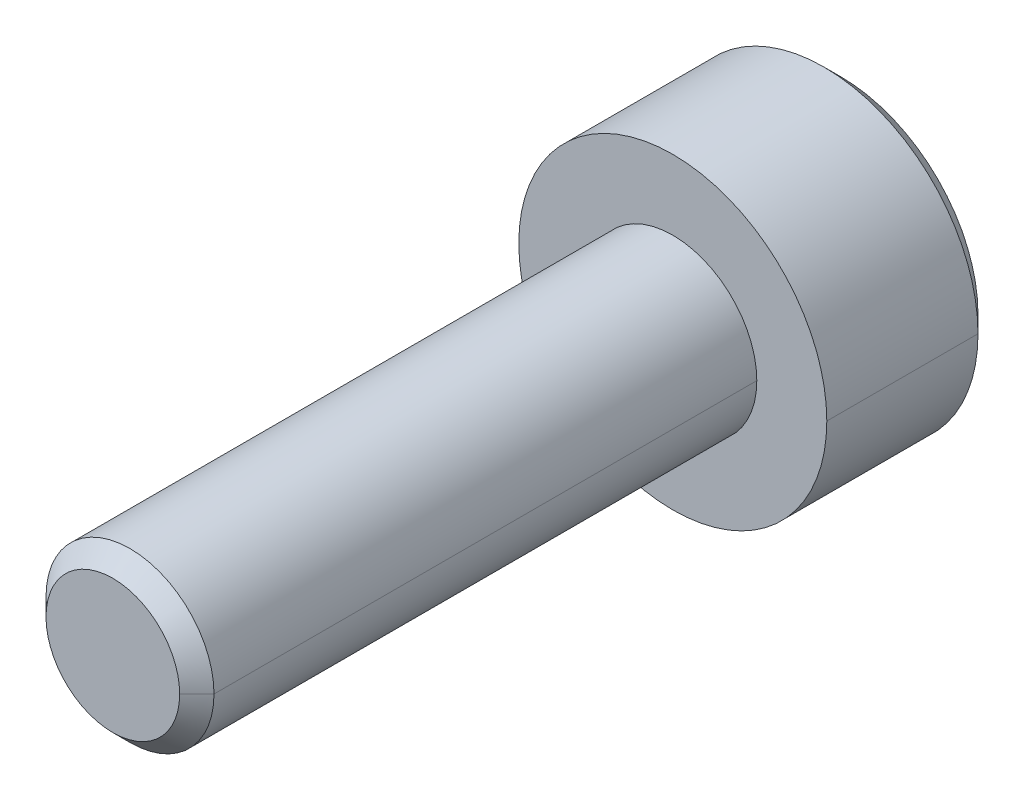
ISO-10303-21;
HEADER;
FILE_DESCRIPTION(('STEP AP214'),'2;1');
FILE_NAME('part.step','',(''),(''),'','','');
FILE_SCHEMA(('AUTOMOTIVE_DESIGN { 1 0 10303 214 1 1 1 1 }'));
ENDSEC;
DATA;
#1=APPLICATION_CONTEXT('core data for automotive mechanical design processes');
#2=APPLICATION_PROTOCOL_DEFINITION('international standard','automotive_design',2000,#1);
#3=PRODUCT_CONTEXT('',#1,'mechanical');
#4=PRODUCT('Part','Part','',(#3));
#5=PRODUCT_RELATED_PRODUCT_CATEGORY('part','',(#4));
#6=PRODUCT_DEFINITION_FORMATION('','',#4);
#7=PRODUCT_DEFINITION_CONTEXT('part definition',#1,'design');
#8=PRODUCT_DEFINITION('design','',#6,#7);
#9=PRODUCT_DEFINITION_SHAPE('','',#8);
#10=(LENGTH_UNIT() NAMED_UNIT(*) SI_UNIT(.MILLI.,.METRE.));
#11=(NAMED_UNIT(*) PLANE_ANGLE_UNIT() SI_UNIT($,.RADIAN.));
#12=(NAMED_UNIT(*) SI_UNIT($,.STERADIAN.) SOLID_ANGLE_UNIT());
#13=UNCERTAINTY_MEASURE_WITH_UNIT(LENGTH_MEASURE(1.E-05),#10,'distance_accuracy_value','');
#14=(GEOMETRIC_REPRESENTATION_CONTEXT(3) GLOBAL_UNCERTAINTY_ASSIGNED_CONTEXT((#13)) GLOBAL_UNIT_ASSIGNED_CONTEXT((#10,
#11,#12)) REPRESENTATION_CONTEXT('',''));
#15=CARTESIAN_POINT('',(0.,0.,0.));
#16=DIRECTION('',(0.,0.,1.));
#17=DIRECTION('',(1.,0.,0.));
#18=AXIS2_PLACEMENT_3D('',#15,#16,#17);
#19=CARTESIAN_POINT('',(0.,0.,1.3));
#20=DIRECTION('',(0.,0.,-1.));
#21=DIRECTION('',(0.,-1.,0.));
#22=AXIS2_PLACEMENT_3D('',#19,#20,#21);
#23=PLANE('',#22);
#24=DIRECTION('',(0.866025403784439,0.5,0.));
#25=VECTOR('',#24,1.);
#26=CARTESIAN_POINT('',(-1.25,0.721687836487033,1.3));
#27=LINE('',#26,#25);
#28=CARTESIAN_POINT('',(-1.25,0.721687836487033,1.3));
#29=VERTEX_POINT('',#28);
#30=CARTESIAN_POINT('',(0.,1.44337567297406,1.3));
#31=VERTEX_POINT('',#30);
#32=EDGE_CURVE('E237',#29,#31,#27,.T.);
#33=ORIENTED_EDGE('',*,*,#32,.T.);
#34=DIRECTION('',(0.866025403784439,-0.5,0.));
#35=VECTOR('',#34,1.);
#36=CARTESIAN_POINT('',(0.,1.44337567297406,1.3));
#37=LINE('',#36,#35);
#38=CARTESIAN_POINT('',(1.25,0.721687836487033,1.3));
#39=VERTEX_POINT('',#38);
#40=EDGE_CURVE('E9',#31,#39,#37,.T.);
#41=ORIENTED_EDGE('',*,*,#40,.T.);
#42=DIRECTION('',(0.,-1.,0.));
#43=VECTOR('',#42,1.);
#44=CARTESIAN_POINT('',(1.25,0.721687836487033,1.3));
#45=LINE('',#44,#43);
#46=CARTESIAN_POINT('',(1.25,-0.721687836487033,1.3));
#47=VERTEX_POINT('',#46);
#48=EDGE_CURVE('E43',#39,#47,#45,.T.);
#49=ORIENTED_EDGE('',*,*,#48,.T.);
#50=DIRECTION('',(-0.866025403784439,-0.5,0.));
#51=VECTOR('',#50,1.);
#52=CARTESIAN_POINT('',(1.25,-0.721687836487033,1.3));
#53=LINE('',#52,#51);
#54=CARTESIAN_POINT('',(0.,-1.44337567297406,1.3));
#55=VERTEX_POINT('',#54);
#56=EDGE_CURVE('E250',#47,#55,#53,.T.);
#57=ORIENTED_EDGE('',*,*,#56,.T.);
#58=DIRECTION('',(-0.866025403784439,0.5,0.));
#59=VECTOR('',#58,1.);
#60=CARTESIAN_POINT('',(0.,-1.44337567297406,1.3));
#61=LINE('',#60,#59);
#62=CARTESIAN_POINT('',(-1.25,-0.721687836487033,1.3));
#63=VERTEX_POINT('',#62);
#64=EDGE_CURVE('E244',#55,#63,#61,.T.);
#65=ORIENTED_EDGE('',*,*,#64,.T.);
#66=DIRECTION('',(0.,1.,0.));
#67=VECTOR('',#66,1.);
#68=CARTESIAN_POINT('',(-1.25,-0.721687836487033,1.3));
#69=LINE('',#68,#67);
#70=EDGE_CURVE('E200',#63,#29,#69,.T.);
#71=ORIENTED_EDGE('',*,*,#70,.T.);
#72=EDGE_LOOP('',(#33,#41,#49,#57,#65,#71));
#73=FACE_BOUND('',#72,.T.);
#74=ADVANCED_FACE('F15',(#73),#23,.T.);
#75=CARTESIAN_POINT('',(0.,1.44337567297406,1.3));
#76=DIRECTION('',(0.5,0.866025403784439,0.));
#77=DIRECTION('',(0.,0.,-1.));
#78=AXIS2_PLACEMENT_3D('',#75,#76,#77);
#79=PLANE('',#78);
#80=DIRECTION('',(0.866025403784439,-0.5,0.));
#81=VECTOR('',#80,1.);
#82=CARTESIAN_POINT('',(0.,1.44337567297406,0.));
#83=LINE('',#82,#81);
#84=CARTESIAN_POINT('',(0.,1.44337567297406,0.));
#85=VERTEX_POINT('',#84);
#86=CARTESIAN_POINT('',(1.25,0.721687836487033,0.));
#87=VERTEX_POINT('',#86);
#88=EDGE_CURVE('E199',#85,#87,#83,.T.);
#89=ORIENTED_EDGE('',*,*,#88,.T.);
#90=DIRECTION('',(0.,0.,-1.));
#91=VECTOR('',#90,1.);
#92=CARTESIAN_POINT('',(1.25,0.721687836487033,1.3));
#93=LINE('',#92,#91);
#94=EDGE_CURVE('E24',#39,#87,#93,.T.);
#95=ORIENTED_EDGE('',*,*,#94,.F.);
#96=ORIENTED_EDGE('',*,*,#40,.F.);
#97=DIRECTION('',(0.,0.,-1.));
#98=VECTOR('',#97,1.);
#99=CARTESIAN_POINT('',(0.,1.44337567297406,1.3));
#100=LINE('',#99,#98);
#101=EDGE_CURVE('E234',#31,#85,#100,.T.);
#102=ORIENTED_EDGE('',*,*,#101,.T.);
#103=EDGE_LOOP('',(#89,#95,#96,#102));
#104=FACE_BOUND('',#103,.T.);
#105=ADVANCED_FACE('F293',(#104),#79,.F.);
#106=CARTESIAN_POINT('',(1.25,0.721687836487033,1.3));
#107=DIRECTION('',(1.,0.,0.));
#108=DIRECTION('',(0.,1.,0.));
#109=AXIS2_PLACEMENT_3D('',#106,#107,#108);
#110=PLANE('',#109);
#111=DIRECTION('',(0.,-1.,0.));
#112=VECTOR('',#111,1.);
#113=CARTESIAN_POINT('',(1.25,0.721687836487033,0.));
#114=LINE('',#113,#112);
#115=CARTESIAN_POINT('',(1.25,-0.721687836487033,0.));
#116=VERTEX_POINT('',#115);
#117=EDGE_CURVE('E224',#87,#116,#114,.T.);
#118=ORIENTED_EDGE('',*,*,#117,.T.);
#119=DIRECTION('',(0.,0.,-1.));
#120=VECTOR('',#119,1.);
#121=CARTESIAN_POINT('',(1.25,-0.721687836487033,1.3));
#122=LINE('',#121,#120);
#123=EDGE_CURVE('E253',#47,#116,#122,.T.);
#124=ORIENTED_EDGE('',*,*,#123,.F.);
#125=ORIENTED_EDGE('',*,*,#48,.F.);
#126=ORIENTED_EDGE('',*,*,#94,.T.);
#127=EDGE_LOOP('',(#118,#124,#125,#126));
#128=FACE_BOUND('',#127,.T.);
#129=ADVANCED_FACE('F298',(#128),#110,.F.);
#130=CARTESIAN_POINT('',(1.25,-0.721687836487033,1.3));
#131=DIRECTION('',(0.5,-0.866025403784439,0.));
#132=DIRECTION('',(0.,0.,-1.));
#133=AXIS2_PLACEMENT_3D('',#130,#131,#132);
#134=PLANE('',#133);
#135=DIRECTION('',(-0.866025403784439,-0.5,0.));
#136=VECTOR('',#135,1.);
#137=CARTESIAN_POINT('',(1.25,-0.721687836487033,0.));
#138=LINE('',#137,#136);
#139=CARTESIAN_POINT('',(0.,-1.44337567297406,0.));
#140=VERTEX_POINT('',#139);
#141=EDGE_CURVE('E220',#116,#140,#138,.T.);
#142=ORIENTED_EDGE('',*,*,#141,.T.);
#143=DIRECTION('',(0.,0.,-1.));
#144=VECTOR('',#143,1.);
#145=CARTESIAN_POINT('',(0.,-1.44337567297406,1.3));
#146=LINE('',#145,#144);
#147=EDGE_CURVE('E247',#55,#140,#146,.T.);
#148=ORIENTED_EDGE('',*,*,#147,.F.);
#149=ORIENTED_EDGE('',*,*,#56,.F.);
#150=ORIENTED_EDGE('',*,*,#123,.T.);
#151=EDGE_LOOP('',(#142,#148,#149,#150));
#152=FACE_BOUND('',#151,.T.);
#153=ADVANCED_FACE('F332',(#152),#134,.F.);
#154=CARTESIAN_POINT('',(0.,-1.44337567297406,1.3));
#155=DIRECTION('',(-0.5,-0.866025403784439,0.));
#156=DIRECTION('',(-0.866025403784439,0.5,0.));
#157=AXIS2_PLACEMENT_3D('',#154,#155,#156);
#158=PLANE('',#157);
#159=DIRECTION('',(-0.866025403784439,0.5,0.));
#160=VECTOR('',#159,1.);
#161=CARTESIAN_POINT('',(0.,-1.44337567297406,0.));
#162=LINE('',#161,#160);
#163=CARTESIAN_POINT('',(-1.25,-0.721687836487033,0.));
#164=VERTEX_POINT('',#163);
#165=EDGE_CURVE('E216',#140,#164,#162,.T.);
#166=ORIENTED_EDGE('',*,*,#165,.T.);
#167=DIRECTION('',(0.,0.,-1.));
#168=VECTOR('',#167,1.);
#169=CARTESIAN_POINT('',(-1.25,-0.721687836487033,1.3));
#170=LINE('',#169,#168);
#171=EDGE_CURVE('E203',#63,#164,#170,.T.);
#172=ORIENTED_EDGE('',*,*,#171,.F.);
#173=ORIENTED_EDGE('',*,*,#64,.F.);
#174=ORIENTED_EDGE('',*,*,#147,.T.);
#175=EDGE_LOOP('',(#166,#172,#173,#174));
#176=FACE_BOUND('',#175,.T.);
#177=ADVANCED_FACE('F17',(#176),#158,.F.);
#178=CARTESIAN_POINT('',(-1.25,-0.721687836487033,1.3));
#179=DIRECTION('',(-1.,0.,0.));
#180=DIRECTION('',(0.,0.,1.));
#181=AXIS2_PLACEMENT_3D('',#178,#179,#180);
#182=PLANE('',#181);
#183=DIRECTION('',(0.,1.,0.));
#184=VECTOR('',#183,1.);
#185=CARTESIAN_POINT('',(-1.25,-0.721687836487033,0.));
#186=LINE('',#185,#184);
#187=CARTESIAN_POINT('',(-1.25,0.721687836487033,0.));
#188=VERTEX_POINT('',#187);
#189=EDGE_CURVE('E212',#164,#188,#186,.T.);
#190=ORIENTED_EDGE('',*,*,#189,.T.);
#191=DIRECTION('',(0.,0.,-1.));
#192=VECTOR('',#191,1.);
#193=CARTESIAN_POINT('',(-1.25,0.721687836487033,1.3));
#194=LINE('',#193,#192);
#195=EDGE_CURVE('E204',#29,#188,#194,.T.);
#196=ORIENTED_EDGE('',*,*,#195,.F.);
#197=ORIENTED_EDGE('',*,*,#70,.F.);
#198=ORIENTED_EDGE('',*,*,#171,.T.);
#199=EDGE_LOOP('',(#190,#196,#197,#198));
#200=FACE_BOUND('',#199,.T.);
#201=ADVANCED_FACE('F309',(#200),#182,.F.);
#202=CARTESIAN_POINT('',(-1.25,0.721687836487033,1.3));
#203=DIRECTION('',(-0.5,0.866025403784439,0.));
#204=DIRECTION('',(0.,0.,1.));
#205=AXIS2_PLACEMENT_3D('',#202,#203,#204);
#206=PLANE('',#205);
#207=DIRECTION('',(0.866025403784439,0.5,0.));
#208=VECTOR('',#207,1.);
#209=CARTESIAN_POINT('',(-1.25,0.721687836487033,0.));
#210=LINE('',#209,#208);
#211=EDGE_CURVE('E208',#188,#85,#210,.T.);
#212=ORIENTED_EDGE('',*,*,#211,.T.);
#213=ORIENTED_EDGE('',*,*,#101,.F.);
#214=ORIENTED_EDGE('',*,*,#32,.F.);
#215=ORIENTED_EDGE('',*,*,#195,.T.);
#216=EDGE_LOOP('',(#212,#213,#214,#215));
#217=FACE_BOUND('',#216,.T.);
#218=ADVANCED_FACE('F306',(#217),#206,.F.);
#219=CARTESIAN_POINT('',(0.,0.,13.));
#220=DIRECTION('',(0.,0.,-1.));
#221=DIRECTION('',(-1.,0.,0.));
#222=AXIS2_PLACEMENT_3D('',#219,#220,#221);
#223=CONICAL_SURFACE('',#222,1.1935,0.785398163397443);
#224=DIRECTION('',(0.707106781186544,0.,-0.707106781186551));
#225=VECTOR('',#224,1.);
#226=CARTESIAN_POINT('',(1.1935,0.,13.));
#227=LINE('',#226,#225);
#228=CARTESIAN_POINT('',(1.1935,0.,13.));
#229=VERTEX_POINT('',#228);
#230=CARTESIAN_POINT('',(1.5,0.,12.6935));
#231=VERTEX_POINT('',#230);
#232=EDGE_CURVE('E674',#229,#231,#227,.T.);
#233=ORIENTED_EDGE('',*,*,#232,.F.);
#234=CARTESIAN_POINT('',(0.,0.,13.));
#235=DIRECTION('',(0.,0.,1.));
#236=DIRECTION('',(1.,0.,0.));
#237=AXIS2_PLACEMENT_3D('',#234,#235,#236);
#238=CIRCLE('',#237,1.1935);
#239=CARTESIAN_POINT('',(-1.1935,0.,13.));
#240=VERTEX_POINT('',#239);
#241=EDGE_CURVE('E231',#240,#229,#238,.T.);
#242=ORIENTED_EDGE('',*,*,#241,.F.);
#243=DIRECTION('',(-0.707106781186544,0.,-0.707106781186551));
#244=VECTOR('',#243,1.);
#245=CARTESIAN_POINT('',(-1.1935,0.,13.));
#246=LINE('',#245,#244);
#247=CARTESIAN_POINT('',(-1.5,0.,12.6935));
#248=VERTEX_POINT('',#247);
#249=EDGE_CURVE('E268',#240,#248,#246,.T.);
#250=ORIENTED_EDGE('',*,*,#249,.T.);
#251=CARTESIAN_POINT('',(0.,0.,12.6935));
#252=DIRECTION('',(0.,0.,-1.));
#253=DIRECTION('',(1.,0.,0.));
#254=AXIS2_PLACEMENT_3D('',#251,#252,#253);
#255=CIRCLE('',#254,1.5);
#256=EDGE_CURVE('E228',#231,#248,#255,.T.);
#257=ORIENTED_EDGE('',*,*,#256,.F.);
#258=EDGE_LOOP('',(#233,#242,#250,#257));
#259=FACE_BOUND('',#258,.T.);
#260=ADVANCED_FACE('F308',(#259),#223,.T.);
#261=CARTESIAN_POINT('',(0.,0.,0.3));
#262=DIRECTION('',(0.,0.,1.));
#263=DIRECTION('',(1.,0.,0.));
#264=AXIS2_PLACEMENT_3D('',#261,#262,#263);
#265=CONICAL_SURFACE('',#264,2.75,0.785398163397452);
#266=DIRECTION('',(-0.707106781186551,0.,0.707106781186545));
#267=VECTOR('',#266,1.);
#268=CARTESIAN_POINT('',(-2.75,0.,0.3));
#269=LINE('',#268,#267);
#270=CARTESIAN_POINT('',(-2.45,0.,0.));
#271=VERTEX_POINT('',#270);
#272=CARTESIAN_POINT('',(-2.75,0.,0.3));
#273=VERTEX_POINT('',#272);
#274=EDGE_CURVE('E170',#271,#273,#269,.T.);
#275=ORIENTED_EDGE('',*,*,#274,.F.);
#276=CARTESIAN_POINT('',(0.,0.,0.));
#277=DIRECTION('',(0.,0.,-1.));
#278=DIRECTION('',(1.,0.,0.));
#279=AXIS2_PLACEMENT_3D('',#276,#277,#278);
#280=CIRCLE('',#279,2.45);
#281=CARTESIAN_POINT('',(2.45,0.,0.));
#282=VERTEX_POINT('',#281);
#283=EDGE_CURVE('E162',#282,#271,#280,.T.);
#284=ORIENTED_EDGE('',*,*,#283,.F.);
#285=DIRECTION('',(0.707106781186551,0.,0.707106781186545));
#286=VECTOR('',#285,1.);
#287=CARTESIAN_POINT('',(2.75,0.,0.3));
#288=LINE('',#287,#286);
#289=CARTESIAN_POINT('',(2.75,0.,0.3));
#290=VERTEX_POINT('',#289);
#291=EDGE_CURVE('E160',#282,#290,#288,.T.);
#292=ORIENTED_EDGE('',*,*,#291,.T.);
#293=CARTESIAN_POINT('',(0.,0.,0.3));
#294=DIRECTION('',(0.,0.,1.));
#295=DIRECTION('',(1.,0.,0.));
#296=AXIS2_PLACEMENT_3D('',#293,#294,#295);
#297=CIRCLE('',#296,2.75);
#298=EDGE_CURVE('E135',#273,#290,#297,.T.);
#299=ORIENTED_EDGE('',*,*,#298,.F.);
#300=EDGE_LOOP('',(#275,#284,#292,#299));
#301=FACE_BOUND('',#300,.T.);
#302=ADVANCED_FACE('F161',(#301),#265,.T.);
#303=CARTESIAN_POINT('',(0.,0.,13.));
#304=DIRECTION('',(0.,0.,1.));
#305=DIRECTION('',(1.,0.,0.));
#306=AXIS2_PLACEMENT_3D('',#303,#304,#305);
#307=PLANE('',#306);
#308=ORIENTED_EDGE('',*,*,#241,.T.);
#309=CARTESIAN_POINT('',(0.,0.,13.));
#310=DIRECTION('',(0.,0.,1.));
#311=DIRECTION('',(1.,0.,0.));
#312=AXIS2_PLACEMENT_3D('',#309,#310,#311);
#313=CIRCLE('',#312,1.1935);
#314=EDGE_CURVE('E671',#229,#240,#313,.T.);
#315=ORIENTED_EDGE('',*,*,#314,.T.);
#316=EDGE_LOOP('',(#308,#315));
#317=FACE_BOUND('',#316,.T.);
#318=ADVANCED_FACE('F288',(#317),#307,.T.);
#319=CARTESIAN_POINT('',(0.,0.,13.));
#320=DIRECTION('',(0.,0.,-1.));
#321=DIRECTION('',(-1.,0.,0.));
#322=AXIS2_PLACEMENT_3D('',#319,#320,#321);
#323=CYLINDRICAL_SURFACE('',#322,1.5);
#324=DIRECTION('',(0.,0.,-1.));
#325=VECTOR('',#324,1.);
#326=CARTESIAN_POINT('',(1.5,0.,13.));
#327=LINE('',#326,#325);
#328=CARTESIAN_POINT('',(1.5,0.,3.));
#329=VERTEX_POINT('',#328);
#330=EDGE_CURVE('E167',#231,#329,#327,.T.);
#331=ORIENTED_EDGE('',*,*,#330,.F.);
#332=ORIENTED_EDGE('',*,*,#256,.T.);
#333=DIRECTION('',(0.,0.,-1.));
#334=VECTOR('',#333,1.);
#335=CARTESIAN_POINT('',(-1.5,0.,13.));
#336=LINE('',#335,#334);
#337=CARTESIAN_POINT('',(-1.5,0.,3.));
#338=VERTEX_POINT('',#337);
#339=EDGE_CURVE('E189',#248,#338,#336,.T.);
#340=ORIENTED_EDGE('',*,*,#339,.T.);
#341=CARTESIAN_POINT('',(0.,0.,3.));
#342=DIRECTION('',(0.,0.,1.));
#343=DIRECTION('',(1.,0.,0.));
#344=AXIS2_PLACEMENT_3D('',#341,#342,#343);
#345=CIRCLE('',#344,1.5);
#346=EDGE_CURVE('E147',#338,#329,#345,.T.);
#347=ORIENTED_EDGE('',*,*,#346,.T.);
#348=EDGE_LOOP('',(#331,#332,#340,#347));
#349=FACE_BOUND('',#348,.T.);
#350=ADVANCED_FACE('F278',(#349),#323,.T.);
#351=CARTESIAN_POINT('',(0.,0.,0.));
#352=DIRECTION('',(0.,0.,1.));
#353=DIRECTION('',(1.,0.,0.));
#354=AXIS2_PLACEMENT_3D('',#351,#352,#353);
#355=PLANE('',#354);
#356=ORIENTED_EDGE('',*,*,#88,.F.);
#357=ORIENTED_EDGE('',*,*,#211,.F.);
#358=ORIENTED_EDGE('',*,*,#189,.F.);
#359=ORIENTED_EDGE('',*,*,#165,.F.);
#360=ORIENTED_EDGE('',*,*,#141,.F.);
#361=ORIENTED_EDGE('',*,*,#117,.F.);
#362=EDGE_LOOP('',(#356,#357,#358,#359,#360,#361));
#363=FACE_BOUND('',#362,.T.);
#364=ORIENTED_EDGE('',*,*,#283,.T.);
#365=CARTESIAN_POINT('',(0.,0.,0.));
#366=DIRECTION('',(0.,0.,-1.));
#367=DIRECTION('',(1.,0.,0.));
#368=AXIS2_PLACEMENT_3D('',#365,#366,#367);
#369=CIRCLE('',#368,2.45);
#370=EDGE_CURVE('E177',#271,#282,#369,.T.);
#371=ORIENTED_EDGE('',*,*,#370,.T.);
#372=EDGE_LOOP('',(#364,#371));
#373=FACE_BOUND('',#372,.T.);
#374=ADVANCED_FACE('F275',(#363,#373),#355,.F.);
#375=CARTESIAN_POINT('',(0.,0.,3.));
#376=DIRECTION('',(0.,0.,1.));
#377=DIRECTION('',(1.,0.,0.));
#378=AXIS2_PLACEMENT_3D('',#375,#376,#377);
#379=PLANE('',#378);
#380=ORIENTED_EDGE('',*,*,#346,.F.);
#381=CARTESIAN_POINT('',(0.,0.,3.));
#382=DIRECTION('',(0.,0.,1.));
#383=DIRECTION('',(1.,0.,0.));
#384=AXIS2_PLACEMENT_3D('',#381,#382,#383);
#385=CIRCLE('',#384,1.5);
#386=EDGE_CURVE('E185',#329,#338,#385,.T.);
#387=ORIENTED_EDGE('',*,*,#386,.F.);
#388=EDGE_LOOP('',(#380,#387));
#389=FACE_BOUND('',#388,.T.);
#390=CARTESIAN_POINT('',(0.,0.,3.));
#391=DIRECTION('',(0.,0.,1.));
#392=DIRECTION('',(1.,0.,0.));
#393=AXIS2_PLACEMENT_3D('',#390,#391,#392);
#394=CIRCLE('',#393,2.75);
#395=CARTESIAN_POINT('',(-2.75,0.,3.));
#396=VERTEX_POINT('',#395);
#397=CARTESIAN_POINT('',(2.75,0.,3.));
#398=VERTEX_POINT('',#397);
#399=EDGE_CURVE('E148',#396,#398,#394,.T.);
#400=ORIENTED_EDGE('',*,*,#399,.T.);
#401=CARTESIAN_POINT('',(0.,0.,3.));
#402=DIRECTION('',(0.,0.,1.));
#403=DIRECTION('',(1.,0.,0.));
#404=AXIS2_PLACEMENT_3D('',#401,#402,#403);
#405=CIRCLE('',#404,2.75);
#406=EDGE_CURVE('E156',#398,#396,#405,.T.);
#407=ORIENTED_EDGE('',*,*,#406,.T.);
#408=EDGE_LOOP('',(#400,#407));
#409=FACE_BOUND('',#408,.T.);
#410=ADVANCED_FACE('F277',(#389,#409),#379,.T.);
#411=CARTESIAN_POINT('',(0.,0.,3.));
#412=DIRECTION('',(0.,0.,-1.));
#413=DIRECTION('',(-1.,0.,0.));
#414=AXIS2_PLACEMENT_3D('',#411,#412,#413);
#415=CYLINDRICAL_SURFACE('',#414,2.75);
#416=DIRECTION('',(0.,0.,-1.));
#417=VECTOR('',#416,1.);
#418=CARTESIAN_POINT('',(2.75,0.,3.));
#419=LINE('',#418,#417);
#420=EDGE_CURVE('E138',#398,#290,#419,.T.);
#421=ORIENTED_EDGE('',*,*,#420,.F.);
#422=ORIENTED_EDGE('',*,*,#399,.F.);
#423=DIRECTION('',(0.,0.,-1.));
#424=VECTOR('',#423,1.);
#425=CARTESIAN_POINT('',(-2.75,0.,3.));
#426=LINE('',#425,#424);
#427=EDGE_CURVE('E141',#396,#273,#426,.T.);
#428=ORIENTED_EDGE('',*,*,#427,.T.);
#429=ORIENTED_EDGE('',*,*,#298,.T.);
#430=EDGE_LOOP('',(#421,#422,#428,#429));
#431=FACE_BOUND('',#430,.T.);
#432=ADVANCED_FACE('F137',(#431),#415,.T.);
#433=CARTESIAN_POINT('',(0.,0.,3.));
#434=DIRECTION('',(0.,0.,-1.));
#435=DIRECTION('',(-1.,0.,0.));
#436=AXIS2_PLACEMENT_3D('',#433,#434,#435);
#437=CYLINDRICAL_SURFACE('',#436,2.75);
#438=ORIENTED_EDGE('',*,*,#406,.F.);
#439=ORIENTED_EDGE('',*,*,#420,.T.);
#440=CARTESIAN_POINT('',(0.,0.,0.3));
#441=DIRECTION('',(0.,0.,1.));
#442=DIRECTION('',(1.,0.,0.));
#443=AXIS2_PLACEMENT_3D('',#440,#441,#442);
#444=CIRCLE('',#443,2.75);
#445=EDGE_CURVE('E153',#290,#273,#444,.T.);
#446=ORIENTED_EDGE('',*,*,#445,.T.);
#447=ORIENTED_EDGE('',*,*,#427,.F.);
#448=EDGE_LOOP('',(#438,#439,#446,#447));
#449=FACE_BOUND('',#448,.T.);
#450=ADVANCED_FACE('F151',(#449),#437,.T.);
#451=CARTESIAN_POINT('',(0.,0.,13.));
#452=DIRECTION('',(0.,0.,-1.));
#453=DIRECTION('',(-1.,0.,0.));
#454=AXIS2_PLACEMENT_3D('',#451,#452,#453);
#455=CYLINDRICAL_SURFACE('',#454,1.5);
#456=CARTESIAN_POINT('',(0.,0.,12.6935));
#457=DIRECTION('',(0.,0.,-1.));
#458=DIRECTION('',(1.,0.,0.));
#459=AXIS2_PLACEMENT_3D('',#456,#457,#458);
#460=CIRCLE('',#459,1.5);
#461=EDGE_CURVE('E265',#248,#231,#460,.T.);
#462=ORIENTED_EDGE('',*,*,#461,.T.);
#463=ORIENTED_EDGE('',*,*,#330,.T.);
#464=ORIENTED_EDGE('',*,*,#386,.T.);
#465=ORIENTED_EDGE('',*,*,#339,.F.);
#466=EDGE_LOOP('',(#462,#463,#464,#465));
#467=FACE_BOUND('',#466,.T.);
#468=ADVANCED_FACE('F343',(#467),#455,.T.);
#469=CARTESIAN_POINT('',(0.,0.,0.3));
#470=DIRECTION('',(0.,0.,1.));
#471=DIRECTION('',(1.,0.,0.));
#472=AXIS2_PLACEMENT_3D('',#469,#470,#471);
#473=CONICAL_SURFACE('',#472,2.75,0.785398163397452);
#474=ORIENTED_EDGE('',*,*,#370,.F.);
#475=ORIENTED_EDGE('',*,*,#274,.T.);
#476=ORIENTED_EDGE('',*,*,#445,.F.);
#477=ORIENTED_EDGE('',*,*,#291,.F.);
#478=EDGE_LOOP('',(#474,#475,#476,#477));
#479=FACE_BOUND('',#478,.T.);
#480=ADVANCED_FACE('F169',(#479),#473,.T.);
#481=CARTESIAN_POINT('',(0.,0.,13.));
#482=DIRECTION('',(0.,0.,-1.));
#483=DIRECTION('',(-1.,0.,0.));
#484=AXIS2_PLACEMENT_3D('',#481,#482,#483);
#485=CONICAL_SURFACE('',#484,1.1935,0.785398163397443);
#486=ORIENTED_EDGE('',*,*,#314,.F.);
#487=ORIENTED_EDGE('',*,*,#232,.T.);
#488=ORIENTED_EDGE('',*,*,#461,.F.);
#489=ORIENTED_EDGE('',*,*,#249,.F.);
#490=EDGE_LOOP('',(#486,#487,#488,#489));
#491=FACE_BOUND('',#490,.T.);
#492=ADVANCED_FACE('F366',(#491),#485,.T.);
#493=CLOSED_SHELL('',(#74,#105,#129,#153,#177,#201,#218,#260,#302,#318,#350,#374,#410,#432,#450,
#468,#480,#492));
#494=MANIFOLD_SOLID_BREP('B1',#493);
#495=ADVANCED_BREP_SHAPE_REPRESENTATION('',(#18,#494),#14);
#496=SHAPE_DEFINITION_REPRESENTATION(#9,#495);
ENDSEC;
END-ISO-10303-21;
